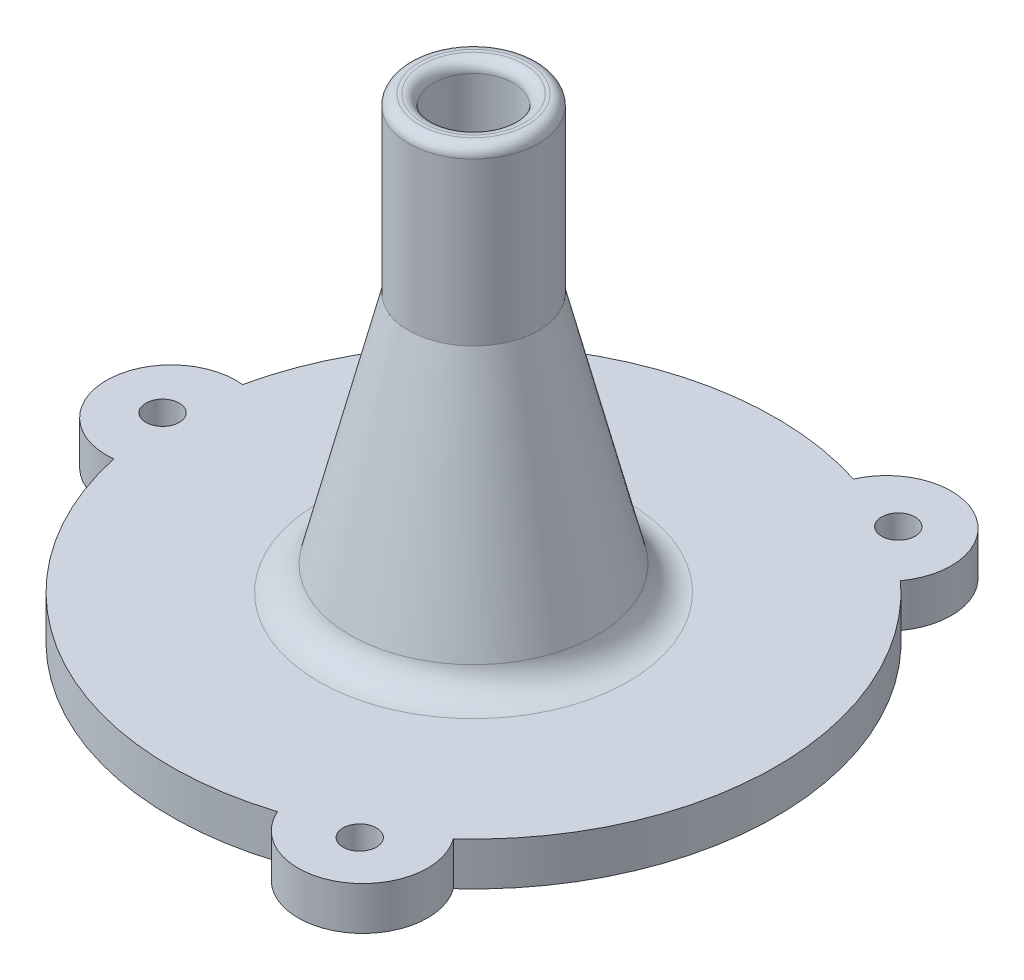
ISO-10303-21;
HEADER;
FILE_DESCRIPTION(('STEP AP214'),'2;1');
FILE_NAME('part.step','',(''),(''),'','','');
FILE_SCHEMA(('AUTOMOTIVE_DESIGN { 1 0 10303 214 1 1 1 1 }'));
ENDSEC;
DATA;
#1=APPLICATION_CONTEXT('core data for automotive mechanical design processes');
#2=APPLICATION_PROTOCOL_DEFINITION('international standard','automotive_design',2000,#1);
#3=PRODUCT_CONTEXT('',#1,'mechanical');
#4=PRODUCT('Part','Part','',(#3));
#5=PRODUCT_RELATED_PRODUCT_CATEGORY('part','',(#4));
#6=PRODUCT_DEFINITION_FORMATION('','',#4);
#7=PRODUCT_DEFINITION_CONTEXT('part definition',#1,'design');
#8=PRODUCT_DEFINITION('design','',#6,#7);
#9=PRODUCT_DEFINITION_SHAPE('','',#8);
#10=(LENGTH_UNIT() NAMED_UNIT(*) SI_UNIT(.MILLI.,.METRE.));
#11=(NAMED_UNIT(*) PLANE_ANGLE_UNIT() SI_UNIT($,.RADIAN.));
#12=(NAMED_UNIT(*) SI_UNIT($,.STERADIAN.) SOLID_ANGLE_UNIT());
#13=UNCERTAINTY_MEASURE_WITH_UNIT(LENGTH_MEASURE(1.E-05),#10,'distance_accuracy_value','');
#14=(GEOMETRIC_REPRESENTATION_CONTEXT(3) GLOBAL_UNCERTAINTY_ASSIGNED_CONTEXT((#13)) GLOBAL_UNIT_ASSIGNED_CONTEXT((#10,
#11,#12)) REPRESENTATION_CONTEXT('',''));
#15=CARTESIAN_POINT('',(0.,0.,0.));
#16=DIRECTION('',(0.,0.,1.));
#17=DIRECTION('',(1.,0.,0.));
#18=AXIS2_PLACEMENT_3D('',#15,#16,#17);
#19=CARTESIAN_POINT('',(0.,4.,0.));
#20=DIRECTION('',(0.,-1.,0.));
#21=DIRECTION('',(0.,0.,-1.));
#22=AXIS2_PLACEMENT_3D('',#19,#20,#21);
#23=CYLINDRICAL_SURFACE('',#22,28.);
#24=CARTESIAN_POINT('',(0.,0.,0.));
#25=DIRECTION('',(0.,1.,0.));
#26=DIRECTION('',(0.,0.,1.));
#27=AXIS2_PLACEMENT_3D('',#24,#25,#26);
#28=CIRCLE('',#27,28.);
#29=CARTESIAN_POINT('',(-27.3571428571429,0.,5.96546181731788));
#30=VERTEX_POINT('',#29);
#31=CARTESIAN_POINT('',(8.51232994946781,0.,26.6747115979047));
#32=VERTEX_POINT('',#31);
#33=EDGE_CURVE('E107',#30,#32,#28,.T.);
#34=ORIENTED_EDGE('',*,*,#33,.T.);
#35=DIRECTION('',(0.,1.,0.));
#36=VECTOR('',#35,1.);
#37=CARTESIAN_POINT('',(8.51232994946781,2.,26.6747115979047));
#38=LINE('',#37,#36);
#39=CARTESIAN_POINT('',(8.51232994946781,4.,26.6747115979047));
#40=VERTEX_POINT('',#39);
#41=EDGE_CURVE('E90',#32,#40,#38,.T.);
#42=ORIENTED_EDGE('',*,*,#41,.T.);
#43=CARTESIAN_POINT('',(0.,4.,0.));
#44=DIRECTION('',(0.,1.,0.));
#45=DIRECTION('',(0.,0.,1.));
#46=AXIS2_PLACEMENT_3D('',#43,#44,#45);
#47=CIRCLE('',#46,28.);
#48=CARTESIAN_POINT('',(-27.3571428571429,4.,5.96546181731788));
#49=VERTEX_POINT('',#48);
#50=EDGE_CURVE('E114',#49,#40,#47,.T.);
#51=ORIENTED_EDGE('',*,*,#50,.F.);
#52=DIRECTION('',(0.,1.,0.));
#53=VECTOR('',#52,1.);
#54=CARTESIAN_POINT('',(-27.3571428571429,2.,5.96546181731788));
#55=LINE('',#54,#53);
#56=EDGE_CURVE('E218',#49,#30,#55,.F.);
#57=ORIENTED_EDGE('',*,*,#56,.T.);
#58=EDGE_LOOP('',(#34,#42,#51,#57));
#59=FACE_BOUND('',#58,.T.);
#60=ADVANCED_FACE('F33',(#59),#23,.T.);
#61=CARTESIAN_POINT('',(18.8448129076746,4.,20.709249780587));
#62=VERTEX_POINT('',#61);
#63=CARTESIAN_POINT('',(18.8448129076749,4.,-20.7092497805867));
#64=VERTEX_POINT('',#63);
#65=EDGE_CURVE('E101',#62,#64,#47,.T.);
#66=ORIENTED_EDGE('',*,*,#65,.F.);
#67=DIRECTION('',(0.,1.,0.));
#68=VECTOR('',#67,1.);
#69=CARTESIAN_POINT('',(18.8448129076746,2.,20.709249780587));
#70=LINE('',#69,#68);
#71=CARTESIAN_POINT('',(18.8448129076746,0.,20.709249780587));
#72=VERTEX_POINT('',#71);
#73=EDGE_CURVE('E87',#62,#72,#70,.F.);
#74=ORIENTED_EDGE('',*,*,#73,.T.);
#75=CARTESIAN_POINT('',(18.8448129076749,0.,-20.7092497805867));
#76=VERTEX_POINT('',#75);
#77=EDGE_CURVE('E99',#72,#76,#28,.T.);
#78=ORIENTED_EDGE('',*,*,#77,.T.);
#79=DIRECTION('',(0.,1.,0.));
#80=VECTOR('',#79,1.);
#81=CARTESIAN_POINT('',(18.8448129076749,2.,-20.7092497805867));
#82=LINE('',#81,#80);
#83=EDGE_CURVE('E225',#76,#64,#82,.T.);
#84=ORIENTED_EDGE('',*,*,#83,.T.);
#85=EDGE_LOOP('',(#66,#74,#78,#84));
#86=FACE_BOUND('',#85,.T.);
#87=ADVANCED_FACE('F97',(#86),#23,.T.);
#88=CARTESIAN_POINT('',(8.51232994946818,4.,-26.6747115979046));
#89=VERTEX_POINT('',#88);
#90=CARTESIAN_POINT('',(-27.3571428571429,4.,-5.96546181731788));
#91=VERTEX_POINT('',#90);
#92=EDGE_CURVE('E110',#89,#91,#47,.T.);
#93=ORIENTED_EDGE('',*,*,#92,.F.);
#94=DIRECTION('',(0.,1.,0.));
#95=VECTOR('',#94,1.);
#96=CARTESIAN_POINT('',(8.51232994946818,2.,-26.6747115979046));
#97=LINE('',#96,#95);
#98=CARTESIAN_POINT('',(8.51232994946818,0.,-26.6747115979046));
#99=VERTEX_POINT('',#98);
#100=EDGE_CURVE('E233',#89,#99,#97,.F.);
#101=ORIENTED_EDGE('',*,*,#100,.T.);
#102=CARTESIAN_POINT('',(-27.3571428571429,0.,-5.96546181731788));
#103=VERTEX_POINT('',#102);
#104=EDGE_CURVE('E108',#99,#103,#28,.T.);
#105=ORIENTED_EDGE('',*,*,#104,.T.);
#106=DIRECTION('',(0.,1.,0.));
#107=VECTOR('',#106,1.);
#108=CARTESIAN_POINT('',(-27.3571428571429,2.,-5.96546181731788));
#109=LINE('',#108,#107);
#110=EDGE_CURVE('E111',#103,#91,#109,.T.);
#111=ORIENTED_EDGE('',*,*,#110,.T.);
#112=EDGE_LOOP('',(#93,#101,#105,#111));
#113=FACE_BOUND('',#112,.T.);
#114=ADVANCED_FACE('F182',(#113),#23,.T.);
#115=CARTESIAN_POINT('',(0.,4.,0.));
#116=DIRECTION('',(0.,1.,0.));
#117=DIRECTION('',(0.,0.,1.));
#118=AXIS2_PLACEMENT_3D('',#115,#116,#117);
#119=PLANE('',#118);
#120=CARTESIAN_POINT('',(-0.000210208256139806,4.,-1.59659225461433E-13));
#121=DIRECTION('',(0.,1.,0.));
#122=DIRECTION('',(0.,0.,1.));
#123=AXIS2_PLACEMENT_3D('',#120,#121,#122);
#124=CIRCLE('',#123,14.3438568795202);
#125=CARTESIAN_POINT('',(-0.000210208256139806,4.,14.34385687952));
#126=VERTEX_POINT('',#125);
#127=EDGE_CURVE('E125',#126,#126,#124,.F.);
#128=ORIENTED_EDGE('',*,*,#127,.T.);
#129=EDGE_LOOP('',(#128));
#130=FACE_BOUND('',#129,.T.);
#131=CARTESIAN_POINT('',(14.4,4.,-24.9415316289918));
#132=DIRECTION('',(0.,1.,0.));
#133=DIRECTION('',(0.,0.,1.));
#134=AXIS2_PLACEMENT_3D('',#131,#132,#133);
#135=CIRCLE('',#134,1.55);
#136=CARTESIAN_POINT('',(14.4,4.,-23.3915316289918));
#137=VERTEX_POINT('',#136);
#138=EDGE_CURVE('E252',#137,#137,#135,.T.);
#139=ORIENTED_EDGE('',*,*,#138,.F.);
#140=EDGE_LOOP('',(#139));
#141=FACE_BOUND('',#140,.T.);
#142=CARTESIAN_POINT('',(14.4,4.,24.9415316289918));
#143=DIRECTION('',(0.,1.,0.));
#144=DIRECTION('',(0.,0.,1.));
#145=AXIS2_PLACEMENT_3D('',#142,#143,#144);
#146=CIRCLE('',#145,1.55);
#147=CARTESIAN_POINT('',(14.4,4.,26.4915316289918));
#148=VERTEX_POINT('',#147);
#149=EDGE_CURVE('E246',#148,#148,#146,.T.);
#150=ORIENTED_EDGE('',*,*,#149,.F.);
#151=EDGE_LOOP('',(#150));
#152=FACE_BOUND('',#151,.T.);
#153=CARTESIAN_POINT('',(-28.8,4.,0.));
#154=DIRECTION('',(0.,1.,0.));
#155=DIRECTION('',(0.,0.,1.));
#156=AXIS2_PLACEMENT_3D('',#153,#154,#155);
#157=CIRCLE('',#156,1.55);
#158=CARTESIAN_POINT('',(-28.8,4.,1.55));
#159=VERTEX_POINT('',#158);
#160=EDGE_CURVE('E240',#159,#159,#157,.T.);
#161=ORIENTED_EDGE('',*,*,#160,.F.);
#162=EDGE_LOOP('',(#161));
#163=FACE_BOUND('',#162,.T.);
#164=ORIENTED_EDGE('',*,*,#50,.T.);
#165=CARTESIAN_POINT('',(13.9999999999998,4.,24.2487113059644));
#166=DIRECTION('',(0.,1.,0.));
#167=DIRECTION('',(0.,0.,1.));
#168=AXIS2_PLACEMENT_3D('',#165,#166,#167);
#169=CIRCLE('',#168,6.);
#170=EDGE_CURVE('E48',#40,#62,#169,.T.);
#171=ORIENTED_EDGE('',*,*,#170,.T.);
#172=ORIENTED_EDGE('',*,*,#65,.T.);
#173=CARTESIAN_POINT('',(14.0000000000001,4.,-24.2487113059642));
#174=DIRECTION('',(0.,1.,0.));
#175=DIRECTION('',(0.,0.,1.));
#176=AXIS2_PLACEMENT_3D('',#173,#174,#175);
#177=CIRCLE('',#176,6.);
#178=EDGE_CURVE('E54',#64,#89,#177,.T.);
#179=ORIENTED_EDGE('',*,*,#178,.T.);
#180=ORIENTED_EDGE('',*,*,#92,.T.);
#181=CARTESIAN_POINT('',(-28.,4.,0.));
#182=DIRECTION('',(0.,1.,0.));
#183=DIRECTION('',(0.,0.,1.));
#184=AXIS2_PLACEMENT_3D('',#181,#182,#183);
#185=CIRCLE('',#184,6.);
#186=EDGE_CURVE('E222',#91,#49,#185,.T.);
#187=ORIENTED_EDGE('',*,*,#186,.T.);
#188=EDGE_LOOP('',(#164,#171,#172,#179,#180,#187));
#189=FACE_BOUND('',#188,.T.);
#190=ADVANCED_FACE('F179',(#130,#141,#152,#163,#189),#119,.T.);
#191=CARTESIAN_POINT('',(0.,0.,0.));
#192=DIRECTION('',(0.,1.,0.));
#193=DIRECTION('',(0.,0.,1.));
#194=AXIS2_PLACEMENT_3D('',#191,#192,#193);
#195=PLANE('',#194);
#196=CARTESIAN_POINT('',(0.,0.,0.));
#197=DIRECTION('',(0.,1.,0.));
#198=DIRECTION('',(0.,0.,1.));
#199=AXIS2_PLACEMENT_3D('',#196,#197,#198);
#200=CIRCLE('',#199,11.8);
#201=CARTESIAN_POINT('',(0.,0.,11.8));
#202=VERTEX_POINT('',#201);
#203=EDGE_CURVE('E116',#202,#202,#200,.T.);
#204=ORIENTED_EDGE('',*,*,#203,.T.);
#205=EDGE_LOOP('',(#204));
#206=FACE_BOUND('',#205,.T.);
#207=CARTESIAN_POINT('',(14.4,0.,-24.9415316289918));
#208=DIRECTION('',(0.,1.,0.));
#209=DIRECTION('',(0.,0.,1.));
#210=AXIS2_PLACEMENT_3D('',#207,#208,#209);
#211=CIRCLE('',#210,1.55);
#212=CARTESIAN_POINT('',(14.4,0.,-23.3915316289918));
#213=VERTEX_POINT('',#212);
#214=EDGE_CURVE('E243',#213,#213,#211,.T.);
#215=ORIENTED_EDGE('',*,*,#214,.T.);
#216=EDGE_LOOP('',(#215));
#217=FACE_BOUND('',#216,.T.);
#218=CARTESIAN_POINT('',(14.4,0.,24.9415316289918));
#219=DIRECTION('',(0.,1.,0.));
#220=DIRECTION('',(0.,0.,1.));
#221=AXIS2_PLACEMENT_3D('',#218,#219,#220);
#222=CIRCLE('',#221,1.55);
#223=CARTESIAN_POINT('',(14.4,0.,26.4915316289918));
#224=VERTEX_POINT('',#223);
#225=EDGE_CURVE('E249',#224,#224,#222,.T.);
#226=ORIENTED_EDGE('',*,*,#225,.T.);
#227=EDGE_LOOP('',(#226));
#228=FACE_BOUND('',#227,.T.);
#229=CARTESIAN_POINT('',(-28.8,0.,0.));
#230=DIRECTION('',(0.,1.,0.));
#231=DIRECTION('',(0.,0.,1.));
#232=AXIS2_PLACEMENT_3D('',#229,#230,#231);
#233=CIRCLE('',#232,1.55);
#234=CARTESIAN_POINT('',(-28.8,0.,1.55));
#235=VERTEX_POINT('',#234);
#236=EDGE_CURVE('E238',#235,#235,#233,.T.);
#237=ORIENTED_EDGE('',*,*,#236,.T.);
#238=EDGE_LOOP('',(#237));
#239=FACE_BOUND('',#238,.T.);
#240=ORIENTED_EDGE('',*,*,#77,.F.);
#241=CARTESIAN_POINT('',(13.9999999999998,0.,24.2487113059644));
#242=DIRECTION('',(0.,1.,0.));
#243=DIRECTION('',(0.,0.,1.));
#244=AXIS2_PLACEMENT_3D('',#241,#242,#243);
#245=CIRCLE('',#244,6.);
#246=EDGE_CURVE('E84',#32,#72,#245,.T.);
#247=ORIENTED_EDGE('',*,*,#246,.F.);
#248=ORIENTED_EDGE('',*,*,#33,.F.);
#249=CARTESIAN_POINT('',(-28.,0.,0.));
#250=DIRECTION('',(0.,1.,0.));
#251=DIRECTION('',(0.,0.,1.));
#252=AXIS2_PLACEMENT_3D('',#249,#250,#251);
#253=CIRCLE('',#252,6.);
#254=EDGE_CURVE('E220',#103,#30,#253,.T.);
#255=ORIENTED_EDGE('',*,*,#254,.F.);
#256=ORIENTED_EDGE('',*,*,#104,.F.);
#257=CARTESIAN_POINT('',(14.0000000000001,0.,-24.2487113059642));
#258=DIRECTION('',(0.,1.,0.));
#259=DIRECTION('',(0.,0.,1.));
#260=AXIS2_PLACEMENT_3D('',#257,#258,#259);
#261=CIRCLE('',#260,6.);
#262=EDGE_CURVE('E106',#76,#99,#261,.T.);
#263=ORIENTED_EDGE('',*,*,#262,.F.);
#264=EDGE_LOOP('',(#240,#247,#248,#255,#256,#263));
#265=FACE_BOUND('',#264,.T.);
#266=ADVANCED_FACE('F104',(#206,#217,#228,#239,#265),#195,.F.);
#267=CARTESIAN_POINT('',(-28.,0.,0.));
#268=DIRECTION('',(0.,1.,0.));
#269=DIRECTION('',(0.,0.,1.));
#270=AXIS2_PLACEMENT_3D('',#267,#268,#269);
#271=CYLINDRICAL_SURFACE('',#270,6.);
#272=ORIENTED_EDGE('',*,*,#110,.F.);
#273=ORIENTED_EDGE('',*,*,#254,.T.);
#274=ORIENTED_EDGE('',*,*,#56,.F.);
#275=ORIENTED_EDGE('',*,*,#186,.F.);
#276=EDGE_LOOP('',(#272,#273,#274,#275));
#277=FACE_BOUND('',#276,.T.);
#278=ADVANCED_FACE('F174',(#277),#271,.T.);
#279=CARTESIAN_POINT('',(14.0000000000001,0.,-24.2487113059642));
#280=DIRECTION('',(0.,1.,0.));
#281=DIRECTION('',(0.,0.,1.));
#282=AXIS2_PLACEMENT_3D('',#279,#280,#281);
#283=CYLINDRICAL_SURFACE('',#282,6.);
#284=ORIENTED_EDGE('',*,*,#83,.F.);
#285=ORIENTED_EDGE('',*,*,#262,.T.);
#286=ORIENTED_EDGE('',*,*,#100,.F.);
#287=ORIENTED_EDGE('',*,*,#178,.F.);
#288=EDGE_LOOP('',(#284,#285,#286,#287));
#289=FACE_BOUND('',#288,.T.);
#290=ADVANCED_FACE('F171',(#289),#283,.T.);
#291=CARTESIAN_POINT('',(13.9999999999998,0.,24.2487113059644));
#292=DIRECTION('',(0.,1.,0.));
#293=DIRECTION('',(0.,0.,1.));
#294=AXIS2_PLACEMENT_3D('',#291,#292,#293);
#295=CYLINDRICAL_SURFACE('',#294,6.);
#296=ORIENTED_EDGE('',*,*,#41,.F.);
#297=ORIENTED_EDGE('',*,*,#246,.T.);
#298=ORIENTED_EDGE('',*,*,#73,.F.);
#299=ORIENTED_EDGE('',*,*,#170,.F.);
#300=EDGE_LOOP('',(#296,#297,#298,#299));
#301=FACE_BOUND('',#300,.T.);
#302=ADVANCED_FACE('F86',(#301),#295,.T.);
#303=CARTESIAN_POINT('',(-28.8,0.,0.));
#304=DIRECTION('',(0.,1.,0.));
#305=DIRECTION('',(0.,0.,1.));
#306=AXIS2_PLACEMENT_3D('',#303,#304,#305);
#307=CYLINDRICAL_SURFACE('',#306,1.55);
#308=ORIENTED_EDGE('',*,*,#236,.F.);
#309=EDGE_LOOP('',(#308));
#310=FACE_BOUND('',#309,.T.);
#311=ORIENTED_EDGE('',*,*,#160,.T.);
#312=EDGE_LOOP('',(#311));
#313=FACE_BOUND('',#312,.T.);
#314=ADVANCED_FACE('F164',(#310,#313),#307,.F.);
#315=CARTESIAN_POINT('',(14.4,0.,24.9415316289918));
#316=DIRECTION('',(0.,1.,0.));
#317=DIRECTION('',(0.,0.,1.));
#318=AXIS2_PLACEMENT_3D('',#315,#316,#317);
#319=CYLINDRICAL_SURFACE('',#318,1.55);
#320=ORIENTED_EDGE('',*,*,#225,.F.);
#321=EDGE_LOOP('',(#320));
#322=FACE_BOUND('',#321,.T.);
#323=ORIENTED_EDGE('',*,*,#149,.T.);
#324=EDGE_LOOP('',(#323));
#325=FACE_BOUND('',#324,.T.);
#326=ADVANCED_FACE('F160',(#322,#325),#319,.F.);
#327=CARTESIAN_POINT('',(14.4,0.,-24.9415316289918));
#328=DIRECTION('',(0.,1.,0.));
#329=DIRECTION('',(0.,0.,1.));
#330=AXIS2_PLACEMENT_3D('',#327,#328,#329);
#331=CYLINDRICAL_SURFACE('',#330,1.55);
#332=ORIENTED_EDGE('',*,*,#214,.F.);
#333=EDGE_LOOP('',(#332));
#334=FACE_BOUND('',#333,.T.);
#335=ORIENTED_EDGE('',*,*,#138,.T.);
#336=EDGE_LOOP('',(#335));
#337=FACE_BOUND('',#336,.T.);
#338=ADVANCED_FACE('F156',(#334,#337),#331,.F.);
#339=CARTESIAN_POINT('',(0.,0.,0.));
#340=DIRECTION('',(0.,1.,0.));
#341=DIRECTION('',(0.,0.,1.));
#342=AXIS2_PLACEMENT_3D('',#339,#340,#341);
#343=CYLINDRICAL_SURFACE('',#342,8.8);
#344=CARTESIAN_POINT('',(0.,3.,0.));
#345=DIRECTION('',(0.,1.,0.));
#346=DIRECTION('',(0.,0.,1.));
#347=AXIS2_PLACEMENT_3D('',#344,#345,#346);
#348=CIRCLE('',#347,8.8);
#349=CARTESIAN_POINT('',(0.,3.,8.8));
#350=VERTEX_POINT('',#349);
#351=EDGE_CURVE('E119',#350,#350,#348,.F.);
#352=ORIENTED_EDGE('',*,*,#351,.T.);
#353=EDGE_LOOP('',(#352));
#354=FACE_BOUND('',#353,.T.);
#355=CARTESIAN_POINT('',(0.,4.,0.));
#356=DIRECTION('',(0.,-1.,0.));
#357=DIRECTION('',(0.,0.,-1.));
#358=AXIS2_PLACEMENT_3D('',#355,#356,#357);
#359=CIRCLE('',#358,8.8);
#360=CARTESIAN_POINT('',(0.,4.,-8.8));
#361=VERTEX_POINT('',#360);
#362=EDGE_CURVE('E260',#361,#361,#359,.T.);
#363=ORIENTED_EDGE('',*,*,#362,.F.);
#364=EDGE_LOOP('',(#363));
#365=FACE_BOUND('',#364,.T.);
#366=ADVANCED_FACE('F150',(#354,#365),#343,.F.);
#367=CARTESIAN_POINT('',(-0.000210208256139806,4.,-1.59659225461433E-13));
#368=DIRECTION('',(0.,-1.,0.));
#369=DIRECTION('',(0.,0.,1.));
#370=AXIS2_PLACEMENT_3D('',#367,#368,#369);
#371=CONICAL_SURFACE('',#370,12.,0.244346095279207);
#372=CARTESIAN_POINT('',(-0.000210208256139806,6.274234313201,-1.59659225461433E-13));
#373=DIRECTION('',(0.,1.,0.));
#374=DIRECTION('',(0.,0.,1.));
#375=AXIS2_PLACEMENT_3D('',#372,#373,#374);
#376=CIRCLE('',#375,11.4329697006922);
#377=CARTESIAN_POINT('',(-0.000210208256139806,6.274234313201,11.432969700692));
#378=VERTEX_POINT('',#377);
#379=EDGE_CURVE('E122',#378,#378,#376,.T.);
#380=ORIENTED_EDGE('',*,*,#379,.T.);
#381=EDGE_LOOP('',(#380));
#382=FACE_BOUND('',#381,.T.);
#383=CARTESIAN_POINT('',(0.,28.,0.));
#384=DIRECTION('',(0.,1.,0.));
#385=DIRECTION('',(0.,0.,1.));
#386=AXIS2_PLACEMENT_3D('',#383,#384,#385);
#387=CIRCLE('',#386,6.01633814001984);
#388=CARTESIAN_POINT('',(0.,28.,6.01633814001984));
#389=VERTEX_POINT('',#388);
#390=EDGE_CURVE('E133',#389,#389,#387,.T.);
#391=ORIENTED_EDGE('',*,*,#390,.F.);
#392=EDGE_LOOP('',(#391));
#393=FACE_BOUND('',#392,.T.);
#394=ADVANCED_FACE('F139',(#382,#393),#371,.T.);
#395=CARTESIAN_POINT('',(0.,3.,0.));
#396=DIRECTION('',(0.,1.,0.));
#397=DIRECTION('',(0.,0.,1.));
#398=AXIS2_PLACEMENT_3D('',#395,#396,#397);
#399=TOROIDAL_SURFACE('',#398,11.8,3.);
#400=ORIENTED_EDGE('',*,*,#351,.F.);
#401=EDGE_LOOP('',(#400));
#402=FACE_BOUND('',#401,.T.);
#403=ORIENTED_EDGE('',*,*,#203,.F.);
#404=EDGE_LOOP('',(#403));
#405=FACE_BOUND('',#404,.T.);
#406=ADVANCED_FACE('F149',(#402,#405),#399,.T.);
#407=CARTESIAN_POINT('',(-0.000210208256139806,7.,-1.59659225461433E-13));
#408=DIRECTION('',(0.,1.,0.));
#409=DIRECTION('',(0.,0.,1.));
#410=AXIS2_PLACEMENT_3D('',#407,#408,#409);
#411=TOROIDAL_SURFACE('',#410,14.3438568795202,3.);
#412=ORIENTED_EDGE('',*,*,#127,.F.);
#413=EDGE_LOOP('',(#412));
#414=FACE_BOUND('',#413,.T.);
#415=ORIENTED_EDGE('',*,*,#379,.F.);
#416=EDGE_LOOP('',(#415));
#417=FACE_BOUND('',#416,.T.);
#418=ADVANCED_FACE('F192',(#414,#417),#411,.F.);
#419=CARTESIAN_POINT('',(0.,4.,0.));
#420=DIRECTION('',(0.,-1.,0.));
#421=DIRECTION('',(0.,0.,-1.));
#422=AXIS2_PLACEMENT_3D('',#419,#420,#421);
#423=CONICAL_SURFACE('',#422,8.8,0.20943951023932);
#424=CARTESIAN_POINT('',(0.,28.,0.));
#425=DIRECTION('',(0.,-1.,0.));
#426=DIRECTION('',(0.,0.,-1.));
#427=AXIS2_PLACEMENT_3D('',#424,#425,#426);
#428=CIRCLE('',#427,3.69864251991946);
#429=CARTESIAN_POINT('',(0.,28.,-3.69864251991946));
#430=VERTEX_POINT('',#429);
#431=EDGE_CURVE('E257',#430,#430,#428,.T.);
#432=ORIENTED_EDGE('',*,*,#431,.F.);
#433=EDGE_LOOP('',(#432));
#434=FACE_BOUND('',#433,.T.);
#435=ORIENTED_EDGE('',*,*,#362,.T.);
#436=EDGE_LOOP('',(#435));
#437=FACE_BOUND('',#436,.T.);
#438=ADVANCED_FACE('F152',(#434,#437),#423,.F.);
#439=CARTESIAN_POINT('',(0.,44.,0.));
#440=DIRECTION('',(0.,1.,0.));
#441=DIRECTION('',(0.,0.,1.));
#442=AXIS2_PLACEMENT_3D('',#439,#440,#441);
#443=PLANE('',#442);
#444=CARTESIAN_POINT('',(0.,44.,0.));
#445=DIRECTION('',(0.,1.,0.));
#446=DIRECTION('',(0.,0.,1.));
#447=AXIS2_PLACEMENT_3D('',#444,#445,#446);
#448=CIRCLE('',#447,4.69864251991946);
#449=CARTESIAN_POINT('',(0.,44.,4.69864251991946));
#450=VERTEX_POINT('',#449);
#451=EDGE_CURVE('E41',#450,#450,#448,.F.);
#452=ORIENTED_EDGE('',*,*,#451,.T.);
#453=EDGE_LOOP('',(#452));
#454=FACE_BOUND('',#453,.T.);
#455=CARTESIAN_POINT('',(0.,44.,0.));
#456=DIRECTION('',(0.,1.,0.));
#457=DIRECTION('',(0.,0.,1.));
#458=AXIS2_PLACEMENT_3D('',#455,#456,#457);
#459=CIRCLE('',#458,5.01633814001984);
#460=CARTESIAN_POINT('',(0.,44.,5.01633814001984));
#461=VERTEX_POINT('',#460);
#462=EDGE_CURVE('E286',#461,#461,#459,.T.);
#463=ORIENTED_EDGE('',*,*,#462,.T.);
#464=EDGE_LOOP('',(#463));
#465=FACE_BOUND('',#464,.T.);
#466=ADVANCED_FACE('F274',(#454,#465),#443,.T.);
#467=CARTESIAN_POINT('',(0.,44.,0.));
#468=DIRECTION('',(0.,-1.,0.));
#469=DIRECTION('',(0.,0.,-1.));
#470=AXIS2_PLACEMENT_3D('',#467,#468,#469);
#471=CYLINDRICAL_SURFACE('',#470,6.01633814001984);
#472=CARTESIAN_POINT('',(0.,43.,0.));
#473=DIRECTION('',(0.,1.,0.));
#474=DIRECTION('',(0.,0.,1.));
#475=AXIS2_PLACEMENT_3D('',#472,#473,#474);
#476=CIRCLE('',#475,6.01633814001984);
#477=CARTESIAN_POINT('',(0.,43.,6.01633814001984));
#478=VERTEX_POINT('',#477);
#479=EDGE_CURVE('E11',#478,#478,#476,.F.);
#480=ORIENTED_EDGE('',*,*,#479,.T.);
#481=EDGE_LOOP('',(#480));
#482=FACE_BOUND('',#481,.T.);
#483=ORIENTED_EDGE('',*,*,#390,.T.);
#484=EDGE_LOOP('',(#483));
#485=FACE_BOUND('',#484,.T.);
#486=ADVANCED_FACE('F205',(#482,#485),#471,.T.);
#487=CARTESIAN_POINT('',(0.,44.,0.));
#488=DIRECTION('',(0.,-1.,0.));
#489=DIRECTION('',(0.,0.,-1.));
#490=AXIS2_PLACEMENT_3D('',#487,#488,#489);
#491=CYLINDRICAL_SURFACE('',#490,3.69864251991946);
#492=CARTESIAN_POINT('',(0.,43.,0.));
#493=DIRECTION('',(0.,1.,0.));
#494=DIRECTION('',(0.,0.,1.));
#495=AXIS2_PLACEMENT_3D('',#492,#493,#494);
#496=CIRCLE('',#495,3.69864251991946);
#497=CARTESIAN_POINT('',(0.,43.,3.69864251991946));
#498=VERTEX_POINT('',#497);
#499=EDGE_CURVE('E128',#498,#498,#496,.T.);
#500=ORIENTED_EDGE('',*,*,#499,.T.);
#501=EDGE_LOOP('',(#500));
#502=FACE_BOUND('',#501,.T.);
#503=ORIENTED_EDGE('',*,*,#431,.T.);
#504=EDGE_LOOP('',(#503));
#505=FACE_BOUND('',#504,.T.);
#506=ADVANCED_FACE('F198',(#502,#505),#491,.F.);
#507=CARTESIAN_POINT('',(0.,43.,0.));
#508=DIRECTION('',(0.,1.,0.));
#509=DIRECTION('',(0.,0.,1.));
#510=AXIS2_PLACEMENT_3D('',#507,#508,#509);
#511=TOROIDAL_SURFACE('',#510,4.69864251991946,1.);
#512=ORIENTED_EDGE('',*,*,#451,.F.);
#513=EDGE_LOOP('',(#512));
#514=FACE_BOUND('',#513,.T.);
#515=ORIENTED_EDGE('',*,*,#499,.F.);
#516=EDGE_LOOP('',(#515));
#517=FACE_BOUND('',#516,.T.);
#518=ADVANCED_FACE('F196',(#514,#517),#511,.T.);
#519=CARTESIAN_POINT('',(0.,43.,0.));
#520=DIRECTION('',(0.,1.,0.));
#521=DIRECTION('',(0.,0.,1.));
#522=AXIS2_PLACEMENT_3D('',#519,#520,#521);
#523=TOROIDAL_SURFACE('',#522,5.01633814001984,1.);
#524=ORIENTED_EDGE('',*,*,#479,.F.);
#525=EDGE_LOOP('',(#524));
#526=FACE_BOUND('',#525,.T.);
#527=ORIENTED_EDGE('',*,*,#462,.F.);
#528=EDGE_LOOP('',(#527));
#529=FACE_BOUND('',#528,.T.);
#530=ADVANCED_FACE('F35',(#526,#529),#523,.T.);
#531=CLOSED_SHELL('',(#60,#87,#114,#190,#266,#278,#290,#302,#314,#326,#338,#366,#394,#406,#418,
#438,#466,#486,#506,#518,#530));
#532=MANIFOLD_SOLID_BREP('B2',#531);
#533=ADVANCED_BREP_SHAPE_REPRESENTATION('',(#18,#532),#14);
#534=SHAPE_DEFINITION_REPRESENTATION(#9,#533);
ENDSEC;
END-ISO-10303-21;
